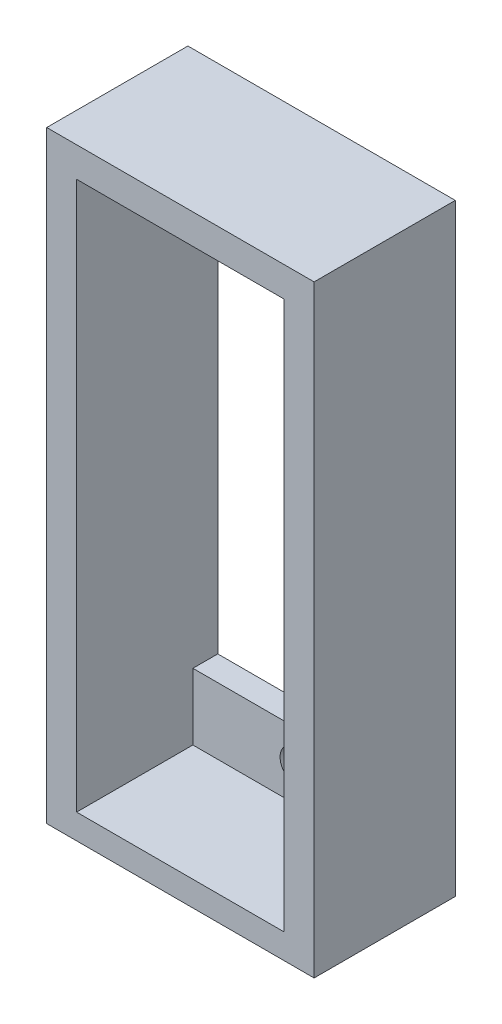
ISO-10303-21;
HEADER;
FILE_DESCRIPTION(('STEP AP214'),'2;1');
FILE_NAME('part.step','',(''),(''),'','','');
FILE_SCHEMA(('AUTOMOTIVE_DESIGN { 1 0 10303 214 1 1 1 1 }'));
ENDSEC;
DATA;
#1=APPLICATION_CONTEXT('core data for automotive mechanical design processes');
#2=APPLICATION_PROTOCOL_DEFINITION('international standard','automotive_design',2000,#1);
#3=PRODUCT_CONTEXT('',#1,'mechanical');
#4=PRODUCT('Part','Part','',(#3));
#5=PRODUCT_RELATED_PRODUCT_CATEGORY('part','',(#4));
#6=PRODUCT_DEFINITION_FORMATION('','',#4);
#7=PRODUCT_DEFINITION_CONTEXT('part definition',#1,'design');
#8=PRODUCT_DEFINITION('design','',#6,#7);
#9=PRODUCT_DEFINITION_SHAPE('','',#8);
#10=(LENGTH_UNIT() NAMED_UNIT(*) SI_UNIT(.MILLI.,.METRE.));
#11=(NAMED_UNIT(*) PLANE_ANGLE_UNIT() SI_UNIT($,.RADIAN.));
#12=(NAMED_UNIT(*) SI_UNIT($,.STERADIAN.) SOLID_ANGLE_UNIT());
#13=UNCERTAINTY_MEASURE_WITH_UNIT(LENGTH_MEASURE(1.E-05),#10,'distance_accuracy_value','');
#14=(GEOMETRIC_REPRESENTATION_CONTEXT(3) GLOBAL_UNCERTAINTY_ASSIGNED_CONTEXT((#13)) GLOBAL_UNIT_ASSIGNED_CONTEXT((#10,
#11,#12)) REPRESENTATION_CONTEXT('',''));
#15=CARTESIAN_POINT('',(0.,0.,0.));
#16=DIRECTION('',(0.,0.,1.));
#17=DIRECTION('',(1.,0.,0.));
#18=AXIS2_PLACEMENT_3D('',#15,#16,#17);
#19=CARTESIAN_POINT('',(-57.4856719225406,21.2865890189122,0.));
#20=DIRECTION('',(-1.,0.,0.));
#21=DIRECTION('',(0.,0.,1.));
#22=AXIS2_PLACEMENT_3D('',#19,#20,#21);
#23=PLANE('',#22);
#24=DIRECTION('',(0.,0.,1.));
#25=VECTOR('',#24,1.);
#26=CARTESIAN_POINT('',(-57.4856719225406,-7.71341098108776,8.9));
#27=LINE('',#26,#25);
#28=CARTESIAN_POINT('',(-57.4856719225406,-7.71341098108776,16.4));
#29=VERTEX_POINT('',#28);
#30=CARTESIAN_POINT('',(-57.4856719225406,-7.71341098108776,17.9));
#31=VERTEX_POINT('',#30);
#32=EDGE_CURVE('E268',#29,#31,#27,.T.);
#33=ORIENTED_EDGE('',*,*,#32,.F.);
#34=DIRECTION('',(0.,1.,0.));
#35=VECTOR('',#34,1.);
#36=CARTESIAN_POINT('',(-57.4856719225406,21.2865890189122,16.4));
#37=LINE('',#36,#35);
#38=CARTESIAN_POINT('',(-57.4856719225406,15.2865890189122,16.4));
#39=VERTEX_POINT('',#38);
#40=EDGE_CURVE('E294',#29,#39,#37,.T.);
#41=ORIENTED_EDGE('',*,*,#40,.T.);
#42=DIRECTION('',(0.,0.,1.));
#43=VECTOR('',#42,1.);
#44=CARTESIAN_POINT('',(-57.4856719225406,15.2865890189122,8.9));
#45=LINE('',#44,#43);
#46=CARTESIAN_POINT('',(-57.4856719225406,15.2865890189122,17.9));
#47=VERTEX_POINT('',#46);
#48=EDGE_CURVE('E270',#39,#47,#45,.T.);
#49=ORIENTED_EDGE('',*,*,#48,.T.);
#50=DIRECTION('',(0.,1.,0.));
#51=VECTOR('',#50,1.);
#52=CARTESIAN_POINT('',(-57.4856719225406,-11.7134109810878,17.9));
#53=LINE('',#52,#51);
#54=CARTESIAN_POINT('',(-57.4856719225406,21.2865890189122,17.9));
#55=VERTEX_POINT('',#54);
#56=EDGE_CURVE('E173',#47,#55,#53,.T.);
#57=ORIENTED_EDGE('',*,*,#56,.T.);
#58=DIRECTION('',(0.,0.,-1.));
#59=VECTOR('',#58,1.);
#60=CARTESIAN_POINT('',(-57.4856719225406,21.2865890189122,24.9));
#61=LINE('',#60,#59);
#62=CARTESIAN_POINT('',(-57.4856719225406,21.2865890189122,24.9));
#63=VERTEX_POINT('',#62);
#64=EDGE_CURVE('E200',#63,#55,#61,.T.);
#65=ORIENTED_EDGE('',*,*,#64,.F.);
#66=DIRECTION('',(0.,-1.,0.));
#67=VECTOR('',#66,1.);
#68=CARTESIAN_POINT('',(-57.4856719225406,21.2865890189122,24.9));
#69=LINE('',#68,#67);
#70=CARTESIAN_POINT('',(-57.4856719225406,-11.7134109810878,24.9));
#71=VERTEX_POINT('',#70);
#72=EDGE_CURVE('E189',#63,#71,#69,.T.);
#73=ORIENTED_EDGE('',*,*,#72,.T.);
#74=DIRECTION('',(0.,0.,-1.));
#75=VECTOR('',#74,1.);
#76=CARTESIAN_POINT('',(-57.4856719225406,-11.7134109810878,24.9));
#77=LINE('',#76,#75);
#78=CARTESIAN_POINT('',(-57.4856719225406,-11.7134109810878,17.9));
#79=VERTEX_POINT('',#78);
#80=EDGE_CURVE('E197',#71,#79,#77,.T.);
#81=ORIENTED_EDGE('',*,*,#80,.T.);
#82=EDGE_CURVE('E178',#79,#31,#53,.T.);
#83=ORIENTED_EDGE('',*,*,#82,.T.);
#84=EDGE_LOOP('',(#33,#41,#49,#57,#65,#73,#81,#83));
#85=FACE_BOUND('',#84,.T.);
#86=ADVANCED_FACE('F33',(#85),#23,.F.);
#87=CARTESIAN_POINT('',(-44.9856719225406,10.5865890189122,0.));
#88=DIRECTION('',(1.,0.,0.));
#89=DIRECTION('',(0.,0.,-1.));
#90=AXIS2_PLACEMENT_3D('',#87,#88,#89);
#91=PLANE('',#90);
#92=DIRECTION('',(0.,0.,1.));
#93=VECTOR('',#92,1.);
#94=CARTESIAN_POINT('',(-44.9856719225406,15.2865890189122,8.9));
#95=LINE('',#94,#93);
#96=CARTESIAN_POINT('',(-44.9856719225406,15.2865890189122,16.4));
#97=VERTEX_POINT('',#96);
#98=CARTESIAN_POINT('',(-44.9856719225406,15.2865890189122,17.9));
#99=VERTEX_POINT('',#98);
#100=EDGE_CURVE('E162',#97,#99,#95,.T.);
#101=ORIENTED_EDGE('',*,*,#100,.F.);
#102=DIRECTION('',(0.,-1.,0.));
#103=VECTOR('',#102,1.);
#104=CARTESIAN_POINT('',(-44.9856719225406,10.5865890189122,16.4));
#105=LINE('',#104,#103);
#106=CARTESIAN_POINT('',(-44.9856719225406,-7.71341098108776,16.4));
#107=VERTEX_POINT('',#106);
#108=EDGE_CURVE('E55',#97,#107,#105,.T.);
#109=ORIENTED_EDGE('',*,*,#108,.T.);
#110=DIRECTION('',(0.,0.,1.));
#111=VECTOR('',#110,1.);
#112=CARTESIAN_POINT('',(-44.9856719225406,-7.71341098108776,8.9));
#113=LINE('',#112,#111);
#114=CARTESIAN_POINT('',(-44.9856719225406,-7.71341098108776,17.9));
#115=VERTEX_POINT('',#114);
#116=EDGE_CURVE('E177',#107,#115,#113,.T.);
#117=ORIENTED_EDGE('',*,*,#116,.T.);
#118=DIRECTION('',(0.,1.,0.));
#119=VECTOR('',#118,1.);
#120=CARTESIAN_POINT('',(-44.9856719225406,-11.7134109810878,17.9));
#121=LINE('',#120,#119);
#122=CARTESIAN_POINT('',(-44.9856719225406,-11.7134109810878,17.9));
#123=VERTEX_POINT('',#122);
#124=EDGE_CURVE('E182',#123,#115,#121,.T.);
#125=ORIENTED_EDGE('',*,*,#124,.F.);
#126=DIRECTION('',(0.,0.,-1.));
#127=VECTOR('',#126,1.);
#128=CARTESIAN_POINT('',(-44.9856719225406,-11.7134109810878,24.9));
#129=LINE('',#128,#127);
#130=CARTESIAN_POINT('',(-44.9856719225406,-11.7134109810878,24.9));
#131=VERTEX_POINT('',#130);
#132=EDGE_CURVE('E194',#131,#123,#129,.T.);
#133=ORIENTED_EDGE('',*,*,#132,.F.);
#134=DIRECTION('',(0.,1.,0.));
#135=VECTOR('',#134,1.);
#136=CARTESIAN_POINT('',(-44.9856719225406,21.2865890189122,24.9));
#137=LINE('',#136,#135);
#138=CARTESIAN_POINT('',(-44.9856719225406,21.2865890189122,24.9));
#139=VERTEX_POINT('',#138);
#140=EDGE_CURVE('E185',#131,#139,#137,.T.);
#141=ORIENTED_EDGE('',*,*,#140,.T.);
#142=DIRECTION('',(0.,0.,-1.));
#143=VECTOR('',#142,1.);
#144=CARTESIAN_POINT('',(-44.9856719225406,21.2865890189122,24.9));
#145=LINE('',#144,#143);
#146=CARTESIAN_POINT('',(-44.9856719225406,21.2865890189122,17.9));
#147=VERTEX_POINT('',#146);
#148=EDGE_CURVE('E203',#139,#147,#145,.T.);
#149=ORIENTED_EDGE('',*,*,#148,.T.);
#150=EDGE_CURVE('E181',#99,#147,#121,.T.);
#151=ORIENTED_EDGE('',*,*,#150,.F.);
#152=EDGE_LOOP('',(#101,#109,#117,#125,#133,#141,#149,#151));
#153=FACE_BOUND('',#152,.T.);
#154=ADVANCED_FACE('F335',(#153),#91,.F.);
#155=CARTESIAN_POINT('',(-57.4856719225406,-11.7134109810878,17.9));
#156=DIRECTION('',(0.,0.,-1.));
#157=DIRECTION('',(-1.,0.,0.));
#158=AXIS2_PLACEMENT_3D('',#155,#156,#157);
#159=PLANE('',#158);
#160=CARTESIAN_POINT('',(-51.2356719225406,18.3365890189122,17.9));
#161=DIRECTION('',(0.,0.,1.));
#162=DIRECTION('',(1.,0.,0.));
#163=AXIS2_PLACEMENT_3D('',#160,#161,#162);
#164=CIRCLE('',#163,0.999999999999998);
#165=CARTESIAN_POINT('',(-50.2356719225406,18.3365890189122,17.9));
#166=VERTEX_POINT('',#165);
#167=EDGE_CURVE('E247',#166,#166,#164,.T.);
#168=ORIENTED_EDGE('',*,*,#167,.F.);
#169=EDGE_LOOP('',(#168));
#170=FACE_BOUND('',#169,.T.);
#171=DIRECTION('',(-1.,0.,0.));
#172=VECTOR('',#171,1.);
#173=CARTESIAN_POINT('',(-44.9856719225406,15.2865890189122,17.9));
#174=LINE('',#173,#172);
#175=CARTESIAN_POINT('',(-49.2356719225406,15.2865890189122,17.9));
#176=VERTEX_POINT('',#175);
#177=EDGE_CURVE('E160',#99,#176,#174,.T.);
#178=ORIENTED_EDGE('',*,*,#177,.F.);
#179=ORIENTED_EDGE('',*,*,#150,.T.);
#180=DIRECTION('',(-1.,0.,0.));
#181=VECTOR('',#180,1.);
#182=CARTESIAN_POINT('',(-57.4856719225406,21.2865890189122,17.9));
#183=LINE('',#182,#181);
#184=EDGE_CURVE('E174',#147,#55,#183,.T.);
#185=ORIENTED_EDGE('',*,*,#184,.T.);
#186=ORIENTED_EDGE('',*,*,#56,.F.);
#187=DIRECTION('',(-1.,0.,0.));
#188=VECTOR('',#187,1.);
#189=CARTESIAN_POINT('',(-53.2356719225406,15.2865890189122,17.9));
#190=LINE('',#189,#188);
#191=CARTESIAN_POINT('',(-53.2356719225406,15.2865890189122,17.9));
#192=VERTEX_POINT('',#191);
#193=EDGE_CURVE('E262',#192,#47,#190,.T.);
#194=ORIENTED_EDGE('',*,*,#193,.F.);
#195=DIRECTION('',(0.,-1.,0.));
#196=VECTOR('',#195,1.);
#197=CARTESIAN_POINT('',(-53.2356719225406,17.2865890189122,17.9));
#198=LINE('',#197,#196);
#199=CARTESIAN_POINT('',(-53.2356719225406,17.2865890189122,17.9));
#200=VERTEX_POINT('',#199);
#201=EDGE_CURVE('E259',#200,#192,#198,.T.);
#202=ORIENTED_EDGE('',*,*,#201,.F.);
#203=DIRECTION('',(-1.,0.,0.));
#204=VECTOR('',#203,1.);
#205=CARTESIAN_POINT('',(-49.2356719225406,17.2865890189122,17.9));
#206=LINE('',#205,#204);
#207=CARTESIAN_POINT('',(-49.2356719225406,17.2865890189122,17.9));
#208=VERTEX_POINT('',#207);
#209=EDGE_CURVE('E256',#208,#200,#206,.T.);
#210=ORIENTED_EDGE('',*,*,#209,.F.);
#211=DIRECTION('',(0.,1.,0.));
#212=VECTOR('',#211,1.);
#213=CARTESIAN_POINT('',(-49.2356719225406,15.2865890189122,17.9));
#214=LINE('',#213,#212);
#215=EDGE_CURVE('E254',#176,#208,#214,.T.);
#216=ORIENTED_EDGE('',*,*,#215,.F.);
#217=EDGE_LOOP('',(#178,#179,#185,#186,#194,#202,#210,#216));
#218=FACE_BOUND('',#217,.T.);
#219=ADVANCED_FACE('F285',(#170,#218),#159,.F.);
#220=CARTESIAN_POINT('',(-51.2356719225406,-9.71341098108776,17.9));
#221=DIRECTION('',(0.,0.,1.));
#222=DIRECTION('',(1.,0.,0.));
#223=AXIS2_PLACEMENT_3D('',#220,#221,#222);
#224=CIRCLE('',#223,0.999999999999998);
#225=CARTESIAN_POINT('',(-50.2356719225406,-9.71341098108776,17.9));
#226=VERTEX_POINT('',#225);
#227=EDGE_CURVE('E248',#226,#226,#224,.T.);
#228=ORIENTED_EDGE('',*,*,#227,.F.);
#229=EDGE_LOOP('',(#228));
#230=FACE_BOUND('',#229,.T.);
#231=DIRECTION('',(1.,0.,0.));
#232=VECTOR('',#231,1.);
#233=CARTESIAN_POINT('',(-44.9856719225406,-7.71341098108776,17.9));
#234=LINE('',#233,#232);
#235=EDGE_CURVE('E166',#31,#115,#234,.T.);
#236=ORIENTED_EDGE('',*,*,#235,.F.);
#237=ORIENTED_EDGE('',*,*,#82,.F.);
#238=DIRECTION('',(-1.,0.,0.));
#239=VECTOR('',#238,1.);
#240=CARTESIAN_POINT('',(-57.4856719225406,-11.7134109810878,17.9));
#241=LINE('',#240,#239);
#242=EDGE_CURVE('E170',#123,#79,#241,.T.);
#243=ORIENTED_EDGE('',*,*,#242,.F.);
#244=ORIENTED_EDGE('',*,*,#124,.T.);
#245=EDGE_LOOP('',(#236,#237,#243,#244));
#246=FACE_BOUND('',#245,.T.);
#247=ADVANCED_FACE('F342',(#230,#246),#159,.F.);
#248=CARTESIAN_POINT('',(-57.4856719225406,-11.7134109810878,24.9));
#249=DIRECTION('',(0.,1.,0.));
#250=DIRECTION('',(0.,0.,1.));
#251=AXIS2_PLACEMENT_3D('',#248,#249,#250);
#252=PLANE('',#251);
#253=ORIENTED_EDGE('',*,*,#132,.T.);
#254=ORIENTED_EDGE('',*,*,#242,.T.);
#255=ORIENTED_EDGE('',*,*,#80,.F.);
#256=DIRECTION('',(1.,0.,0.));
#257=VECTOR('',#256,1.);
#258=CARTESIAN_POINT('',(-57.4856719225406,-11.7134109810878,24.9));
#259=LINE('',#258,#257);
#260=EDGE_CURVE('E192',#71,#131,#259,.T.);
#261=ORIENTED_EDGE('',*,*,#260,.T.);
#262=EDGE_LOOP('',(#253,#254,#255,#261));
#263=FACE_BOUND('',#262,.T.);
#264=ADVANCED_FACE('F339',(#263),#252,.T.);
#265=CARTESIAN_POINT('',(-57.4856719225406,21.2865890189122,24.9));
#266=DIRECTION('',(0.,-1.,0.));
#267=DIRECTION('',(1.,0.,0.));
#268=AXIS2_PLACEMENT_3D('',#265,#266,#267);
#269=PLANE('',#268);
#270=ORIENTED_EDGE('',*,*,#64,.T.);
#271=ORIENTED_EDGE('',*,*,#184,.F.);
#272=ORIENTED_EDGE('',*,*,#148,.F.);
#273=DIRECTION('',(-1.,0.,0.));
#274=VECTOR('',#273,1.);
#275=CARTESIAN_POINT('',(-57.4856719225406,21.2865890189122,24.9));
#276=LINE('',#275,#274);
#277=EDGE_CURVE('E187',#139,#63,#276,.T.);
#278=ORIENTED_EDGE('',*,*,#277,.T.);
#279=EDGE_LOOP('',(#270,#271,#272,#278));
#280=FACE_BOUND('',#279,.T.);
#281=ADVANCED_FACE('F321',(#280),#269,.T.);
#282=CARTESIAN_POINT('',(0.,0.,24.9));
#283=DIRECTION('',(0.,0.,1.));
#284=DIRECTION('',(1.,0.,0.));
#285=AXIS2_PLACEMENT_3D('',#282,#283,#284);
#286=PLANE('',#285);
#287=DIRECTION('',(0.,-1.,0.));
#288=VECTOR('',#287,1.);
#289=CARTESIAN_POINT('',(-59.2856719225406,23.0865890189122,24.9));
#290=LINE('',#289,#288);
#291=CARTESIAN_POINT('',(-59.2856719225406,23.0865890189122,24.9));
#292=VERTEX_POINT('',#291);
#293=CARTESIAN_POINT('',(-59.2856719225406,-13.2134109810878,24.9));
#294=VERTEX_POINT('',#293);
#295=EDGE_CURVE('E206',#292,#294,#290,.T.);
#296=ORIENTED_EDGE('',*,*,#295,.T.);
#297=DIRECTION('',(1.,0.,0.));
#298=VECTOR('',#297,1.);
#299=CARTESIAN_POINT('',(-59.2856719225406,-13.2134109810878,24.9));
#300=LINE('',#299,#298);
#301=CARTESIAN_POINT('',(-43.1856719225406,-13.2134109810878,24.9));
#302=VERTEX_POINT('',#301);
#303=EDGE_CURVE('E209',#294,#302,#300,.T.);
#304=ORIENTED_EDGE('',*,*,#303,.T.);
#305=DIRECTION('',(0.,1.,0.));
#306=VECTOR('',#305,1.);
#307=CARTESIAN_POINT('',(-43.1856719225406,23.0865890189122,24.9));
#308=LINE('',#307,#306);
#309=CARTESIAN_POINT('',(-43.1856719225406,23.0865890189122,24.9));
#310=VERTEX_POINT('',#309);
#311=EDGE_CURVE('E211',#302,#310,#308,.T.);
#312=ORIENTED_EDGE('',*,*,#311,.T.);
#313=DIRECTION('',(-1.,0.,0.));
#314=VECTOR('',#313,1.);
#315=CARTESIAN_POINT('',(-59.2856719225406,23.0865890189122,24.9));
#316=LINE('',#315,#314);
#317=EDGE_CURVE('E213',#310,#292,#316,.T.);
#318=ORIENTED_EDGE('',*,*,#317,.T.);
#319=EDGE_LOOP('',(#296,#304,#312,#318));
#320=FACE_BOUND('',#319,.T.);
#321=ORIENTED_EDGE('',*,*,#277,.F.);
#322=ORIENTED_EDGE('',*,*,#140,.F.);
#323=ORIENTED_EDGE('',*,*,#260,.F.);
#324=ORIENTED_EDGE('',*,*,#72,.F.);
#325=EDGE_LOOP('',(#321,#322,#323,#324));
#326=FACE_BOUND('',#325,.T.);
#327=ADVANCED_FACE('F318',(#320,#326),#286,.T.);
#328=CARTESIAN_POINT('',(-59.2856719225406,23.0865890189122,24.9));
#329=DIRECTION('',(0.,-1.,0.));
#330=DIRECTION('',(0.,0.,-1.));
#331=AXIS2_PLACEMENT_3D('',#328,#329,#330);
#332=PLANE('',#331);
#333=DIRECTION('',(0.,0.,-1.));
#334=VECTOR('',#333,1.);
#335=CARTESIAN_POINT('',(-43.1856719225406,23.0865890189122,24.9));
#336=LINE('',#335,#334);
#337=CARTESIAN_POINT('',(-43.1856719225406,23.0865890189122,16.4));
#338=VERTEX_POINT('',#337);
#339=EDGE_CURVE('E218',#310,#338,#336,.T.);
#340=ORIENTED_EDGE('',*,*,#339,.T.);
#341=DIRECTION('',(-1.,0.,0.));
#342=VECTOR('',#341,1.);
#343=CARTESIAN_POINT('',(-59.2856719225406,23.0865890189122,16.4));
#344=LINE('',#343,#342);
#345=CARTESIAN_POINT('',(-59.2856719225406,23.0865890189122,16.4));
#346=VERTEX_POINT('',#345);
#347=EDGE_CURVE('E245',#338,#346,#344,.T.);
#348=ORIENTED_EDGE('',*,*,#347,.T.);
#349=DIRECTION('',(0.,0.,-1.));
#350=VECTOR('',#349,1.);
#351=CARTESIAN_POINT('',(-59.2856719225406,23.0865890189122,24.9));
#352=LINE('',#351,#350);
#353=EDGE_CURVE('E215',#292,#346,#352,.T.);
#354=ORIENTED_EDGE('',*,*,#353,.F.);
#355=ORIENTED_EDGE('',*,*,#317,.F.);
#356=EDGE_LOOP('',(#340,#348,#354,#355));
#357=FACE_BOUND('',#356,.T.);
#358=ADVANCED_FACE('F316',(#357),#332,.F.);
#359=CARTESIAN_POINT('',(-43.1856719225406,23.0865890189122,24.9));
#360=DIRECTION('',(-1.,0.,0.));
#361=DIRECTION('',(0.,-1.,0.));
#362=AXIS2_PLACEMENT_3D('',#359,#360,#361);
#363=PLANE('',#362);
#364=DIRECTION('',(0.,0.,-1.));
#365=VECTOR('',#364,1.);
#366=CARTESIAN_POINT('',(-43.1856719225406,-13.2134109810878,24.9));
#367=LINE('',#366,#365);
#368=CARTESIAN_POINT('',(-43.1856719225406,-13.2134109810878,16.4));
#369=VERTEX_POINT('',#368);
#370=EDGE_CURVE('E221',#302,#369,#367,.T.);
#371=ORIENTED_EDGE('',*,*,#370,.T.);
#372=DIRECTION('',(0.,1.,0.));
#373=VECTOR('',#372,1.);
#374=CARTESIAN_POINT('',(-43.1856719225406,23.0865890189122,16.4));
#375=LINE('',#374,#373);
#376=EDGE_CURVE('E236',#369,#338,#375,.T.);
#377=ORIENTED_EDGE('',*,*,#376,.T.);
#378=ORIENTED_EDGE('',*,*,#339,.F.);
#379=ORIENTED_EDGE('',*,*,#311,.F.);
#380=EDGE_LOOP('',(#371,#377,#378,#379));
#381=FACE_BOUND('',#380,.T.);
#382=ADVANCED_FACE('F312',(#381),#363,.F.);
#383=CARTESIAN_POINT('',(-59.2856719225406,-13.2134109810878,24.9));
#384=DIRECTION('',(0.,1.,0.));
#385=DIRECTION('',(0.,0.,1.));
#386=AXIS2_PLACEMENT_3D('',#383,#384,#385);
#387=PLANE('',#386);
#388=DIRECTION('',(0.,0.,-1.));
#389=VECTOR('',#388,1.);
#390=CARTESIAN_POINT('',(-59.2856719225406,-13.2134109810878,24.9));
#391=LINE('',#390,#389);
#392=CARTESIAN_POINT('',(-59.2856719225406,-13.2134109810878,16.4));
#393=VERTEX_POINT('',#392);
#394=EDGE_CURVE('E40',#294,#393,#391,.T.);
#395=ORIENTED_EDGE('',*,*,#394,.T.);
#396=DIRECTION('',(1.,0.,0.));
#397=VECTOR('',#396,1.);
#398=CARTESIAN_POINT('',(-59.2856719225406,-13.2134109810878,16.4));
#399=LINE('',#398,#397);
#400=EDGE_CURVE('E47',#393,#369,#399,.T.);
#401=ORIENTED_EDGE('',*,*,#400,.T.);
#402=ORIENTED_EDGE('',*,*,#370,.F.);
#403=ORIENTED_EDGE('',*,*,#303,.F.);
#404=EDGE_LOOP('',(#395,#401,#402,#403));
#405=FACE_BOUND('',#404,.T.);
#406=ADVANCED_FACE('F226',(#405),#387,.F.);
#407=CARTESIAN_POINT('',(-59.2856719225406,23.0865890189122,24.9));
#408=DIRECTION('',(1.,0.,0.));
#409=DIRECTION('',(0.,0.,-1.));
#410=AXIS2_PLACEMENT_3D('',#407,#408,#409);
#411=PLANE('',#410);
#412=ORIENTED_EDGE('',*,*,#353,.T.);
#413=DIRECTION('',(0.,-1.,0.));
#414=VECTOR('',#413,1.);
#415=CARTESIAN_POINT('',(-59.2856719225406,23.0865890189122,16.4));
#416=LINE('',#415,#414);
#417=EDGE_CURVE('E231',#346,#393,#416,.T.);
#418=ORIENTED_EDGE('',*,*,#417,.T.);
#419=ORIENTED_EDGE('',*,*,#394,.F.);
#420=ORIENTED_EDGE('',*,*,#295,.F.);
#421=EDGE_LOOP('',(#412,#418,#419,#420));
#422=FACE_BOUND('',#421,.T.);
#423=ADVANCED_FACE('F230',(#422),#411,.F.);
#424=CARTESIAN_POINT('',(-51.2356719225406,-9.71341098108776,8.9));
#425=DIRECTION('',(0.,0.,1.));
#426=DIRECTION('',(1.,0.,0.));
#427=AXIS2_PLACEMENT_3D('',#424,#425,#426);
#428=CYLINDRICAL_SURFACE('',#427,0.999999999999998);
#429=CARTESIAN_POINT('',(-51.2356719225406,-9.71341098108776,16.4));
#430=DIRECTION('',(0.,0.,1.));
#431=DIRECTION('',(1.,0.,0.));
#432=AXIS2_PLACEMENT_3D('',#429,#430,#431);
#433=CIRCLE('',#432,0.999999999999998);
#434=CARTESIAN_POINT('',(-50.2356719225406,-9.71341098108776,16.4));
#435=VERTEX_POINT('',#434);
#436=EDGE_CURVE('E234',#435,#435,#433,.F.);
#437=ORIENTED_EDGE('',*,*,#436,.T.);
#438=EDGE_LOOP('',(#437));
#439=FACE_BOUND('',#438,.T.);
#440=ORIENTED_EDGE('',*,*,#227,.T.);
#441=EDGE_LOOP('',(#440));
#442=FACE_BOUND('',#441,.T.);
#443=ADVANCED_FACE('F353',(#439,#442),#428,.F.);
#444=CARTESIAN_POINT('',(-51.2356719225406,18.3365890189122,8.9));
#445=DIRECTION('',(0.,0.,1.));
#446=DIRECTION('',(1.,0.,0.));
#447=AXIS2_PLACEMENT_3D('',#444,#445,#446);
#448=CYLINDRICAL_SURFACE('',#447,0.999999999999998);
#449=CARTESIAN_POINT('',(-51.2356719225406,18.3365890189122,16.4));
#450=DIRECTION('',(0.,0.,1.));
#451=DIRECTION('',(1.,0.,0.));
#452=AXIS2_PLACEMENT_3D('',#449,#450,#451);
#453=CIRCLE('',#452,0.999999999999998);
#454=CARTESIAN_POINT('',(-50.2356719225406,18.3365890189122,16.4));
#455=VERTEX_POINT('',#454);
#456=EDGE_CURVE('E239',#455,#455,#453,.F.);
#457=ORIENTED_EDGE('',*,*,#456,.T.);
#458=EDGE_LOOP('',(#457));
#459=FACE_BOUND('',#458,.T.);
#460=ORIENTED_EDGE('',*,*,#167,.T.);
#461=EDGE_LOOP('',(#460));
#462=FACE_BOUND('',#461,.T.);
#463=ADVANCED_FACE('F305',(#459,#462),#448,.F.);
#464=CARTESIAN_POINT('',(-44.9856719225406,-7.71341098108776,8.9));
#465=DIRECTION('',(0.,-1.,0.));
#466=DIRECTION('',(1.,0.,0.));
#467=AXIS2_PLACEMENT_3D('',#464,#465,#466);
#468=PLANE('',#467);
#469=ORIENTED_EDGE('',*,*,#116,.F.);
#470=DIRECTION('',(-1.,0.,0.));
#471=VECTOR('',#470,1.);
#472=CARTESIAN_POINT('',(-44.9856719225406,-7.71341098108776,16.4));
#473=LINE('',#472,#471);
#474=EDGE_CURVE('E300',#107,#29,#473,.T.);
#475=ORIENTED_EDGE('',*,*,#474,.T.);
#476=ORIENTED_EDGE('',*,*,#32,.T.);
#477=ORIENTED_EDGE('',*,*,#235,.T.);
#478=EDGE_LOOP('',(#469,#475,#476,#477));
#479=FACE_BOUND('',#478,.T.);
#480=ADVANCED_FACE('F345',(#479),#468,.F.);
#481=CARTESIAN_POINT('',(-53.2356719225406,15.2865890189122,8.9));
#482=DIRECTION('',(0.,1.,0.));
#483=DIRECTION('',(-1.,0.,0.));
#484=AXIS2_PLACEMENT_3D('',#481,#482,#483);
#485=PLANE('',#484);
#486=ORIENTED_EDGE('',*,*,#48,.F.);
#487=DIRECTION('',(1.,0.,0.));
#488=VECTOR('',#487,1.);
#489=CARTESIAN_POINT('',(-53.2356719225406,15.2865890189122,16.4));
#490=LINE('',#489,#488);
#491=CARTESIAN_POINT('',(-53.2356719225406,15.2865890189122,16.4));
#492=VERTEX_POINT('',#491);
#493=EDGE_CURVE('E291',#39,#492,#490,.T.);
#494=ORIENTED_EDGE('',*,*,#493,.T.);
#495=DIRECTION('',(0.,0.,1.));
#496=VECTOR('',#495,1.);
#497=CARTESIAN_POINT('',(-53.2356719225406,15.2865890189122,8.9));
#498=LINE('',#497,#496);
#499=EDGE_CURVE('E272',#492,#192,#498,.T.);
#500=ORIENTED_EDGE('',*,*,#499,.T.);
#501=ORIENTED_EDGE('',*,*,#193,.T.);
#502=EDGE_LOOP('',(#486,#494,#500,#501));
#503=FACE_BOUND('',#502,.T.);
#504=ADVANCED_FACE('F289',(#503),#485,.F.);
#505=CARTESIAN_POINT('',(-53.2356719225406,17.2865890189122,8.9));
#506=DIRECTION('',(-1.,0.,0.));
#507=DIRECTION('',(0.,0.,1.));
#508=AXIS2_PLACEMENT_3D('',#505,#506,#507);
#509=PLANE('',#508);
#510=ORIENTED_EDGE('',*,*,#499,.F.);
#511=DIRECTION('',(0.,1.,0.));
#512=VECTOR('',#511,1.);
#513=CARTESIAN_POINT('',(-53.2356719225406,17.2865890189122,16.4));
#514=LINE('',#513,#512);
#515=CARTESIAN_POINT('',(-53.2356719225406,17.2865890189122,16.4));
#516=VERTEX_POINT('',#515);
#517=EDGE_CURVE('E280',#492,#516,#514,.T.);
#518=ORIENTED_EDGE('',*,*,#517,.T.);
#519=DIRECTION('',(0.,0.,1.));
#520=VECTOR('',#519,1.);
#521=CARTESIAN_POINT('',(-53.2356719225406,17.2865890189122,8.9));
#522=LINE('',#521,#520);
#523=EDGE_CURVE('E164',#516,#200,#522,.T.);
#524=ORIENTED_EDGE('',*,*,#523,.T.);
#525=ORIENTED_EDGE('',*,*,#201,.T.);
#526=EDGE_LOOP('',(#510,#518,#524,#525));
#527=FACE_BOUND('',#526,.T.);
#528=ADVANCED_FACE('F277',(#527),#509,.F.);
#529=CARTESIAN_POINT('',(-49.2356719225406,17.2865890189122,8.9));
#530=DIRECTION('',(0.,1.,0.));
#531=DIRECTION('',(0.,0.,1.));
#532=AXIS2_PLACEMENT_3D('',#529,#530,#531);
#533=PLANE('',#532);
#534=ORIENTED_EDGE('',*,*,#523,.F.);
#535=DIRECTION('',(1.,0.,0.));
#536=VECTOR('',#535,1.);
#537=CARTESIAN_POINT('',(-49.2356719225406,17.2865890189122,16.4));
#538=LINE('',#537,#536);
#539=CARTESIAN_POINT('',(-49.2356719225406,17.2865890189122,16.4));
#540=VERTEX_POINT('',#539);
#541=EDGE_CURVE('E156',#516,#540,#538,.T.);
#542=ORIENTED_EDGE('',*,*,#541,.T.);
#543=DIRECTION('',(0.,0.,1.));
#544=VECTOR('',#543,1.);
#545=CARTESIAN_POINT('',(-49.2356719225406,17.2865890189122,8.9));
#546=LINE('',#545,#544);
#547=EDGE_CURVE('E155',#540,#208,#546,.T.);
#548=ORIENTED_EDGE('',*,*,#547,.T.);
#549=ORIENTED_EDGE('',*,*,#209,.T.);
#550=EDGE_LOOP('',(#534,#542,#548,#549));
#551=FACE_BOUND('',#550,.T.);
#552=ADVANCED_FACE('F283',(#551),#533,.F.);
#553=CARTESIAN_POINT('',(-49.2356719225406,15.2865890189122,8.9));
#554=DIRECTION('',(1.,0.,0.));
#555=DIRECTION('',(0.,0.,-1.));
#556=AXIS2_PLACEMENT_3D('',#553,#554,#555);
#557=PLANE('',#556);
#558=ORIENTED_EDGE('',*,*,#547,.F.);
#559=DIRECTION('',(0.,-1.,0.));
#560=VECTOR('',#559,1.);
#561=CARTESIAN_POINT('',(-49.2356719225406,15.2865890189122,16.4));
#562=LINE('',#561,#560);
#563=CARTESIAN_POINT('',(-49.2356719225406,15.2865890189122,16.4));
#564=VERTEX_POINT('',#563);
#565=EDGE_CURVE('E144',#540,#564,#562,.T.);
#566=ORIENTED_EDGE('',*,*,#565,.T.);
#567=DIRECTION('',(0.,0.,1.));
#568=VECTOR('',#567,1.);
#569=CARTESIAN_POINT('',(-49.2356719225406,15.2865890189122,8.9));
#570=LINE('',#569,#568);
#571=EDGE_CURVE('E153',#564,#176,#570,.T.);
#572=ORIENTED_EDGE('',*,*,#571,.T.);
#573=ORIENTED_EDGE('',*,*,#215,.T.);
#574=EDGE_LOOP('',(#558,#566,#572,#573));
#575=FACE_BOUND('',#574,.T.);
#576=ADVANCED_FACE('F151',(#575),#557,.F.);
#577=CARTESIAN_POINT('',(-44.9856719225406,15.2865890189122,8.9));
#578=DIRECTION('',(0.,1.,0.));
#579=DIRECTION('',(0.,0.,1.));
#580=AXIS2_PLACEMENT_3D('',#577,#578,#579);
#581=PLANE('',#580);
#582=ORIENTED_EDGE('',*,*,#571,.F.);
#583=DIRECTION('',(1.,0.,0.));
#584=VECTOR('',#583,1.);
#585=CARTESIAN_POINT('',(-44.9856719225406,15.2865890189122,16.4));
#586=LINE('',#585,#584);
#587=EDGE_CURVE('E11',#564,#97,#586,.T.);
#588=ORIENTED_EDGE('',*,*,#587,.T.);
#589=ORIENTED_EDGE('',*,*,#100,.T.);
#590=ORIENTED_EDGE('',*,*,#177,.T.);
#591=EDGE_LOOP('',(#582,#588,#589,#590));
#592=FACE_BOUND('',#591,.T.);
#593=ADVANCED_FACE('F158',(#592),#581,.F.);
#594=CARTESIAN_POINT('',(-51.7497754564251,10.1317910065859,16.4));
#595=DIRECTION('',(0.,0.,1.));
#596=DIRECTION('',(1.,0.,0.));
#597=AXIS2_PLACEMENT_3D('',#594,#595,#596);
#598=PLANE('',#597);
#599=ORIENTED_EDGE('',*,*,#436,.F.);
#600=EDGE_LOOP('',(#599));
#601=FACE_BOUND('',#600,.T.);
#602=ORIENTED_EDGE('',*,*,#108,.F.);
#603=ORIENTED_EDGE('',*,*,#587,.F.);
#604=ORIENTED_EDGE('',*,*,#565,.F.);
#605=ORIENTED_EDGE('',*,*,#541,.F.);
#606=ORIENTED_EDGE('',*,*,#517,.F.);
#607=ORIENTED_EDGE('',*,*,#493,.F.);
#608=ORIENTED_EDGE('',*,*,#40,.F.);
#609=ORIENTED_EDGE('',*,*,#474,.F.);
#610=EDGE_LOOP('',(#602,#603,#604,#605,#606,#607,#608,#609));
#611=FACE_BOUND('',#610,.T.);
#612=ORIENTED_EDGE('',*,*,#456,.F.);
#613=EDGE_LOOP('',(#612));
#614=FACE_BOUND('',#613,.T.);
#615=ORIENTED_EDGE('',*,*,#376,.F.);
#616=ORIENTED_EDGE('',*,*,#400,.F.);
#617=ORIENTED_EDGE('',*,*,#417,.F.);
#618=ORIENTED_EDGE('',*,*,#347,.F.);
#619=EDGE_LOOP('',(#615,#616,#617,#618));
#620=FACE_BOUND('',#619,.T.);
#621=ADVANCED_FACE('F142',(#601,#611,#614,#620),#598,.F.);
#622=CLOSED_SHELL('',(#86,#154,#219,#247,#264,#281,#327,#358,#382,#406,#423,#443,#463,#480,#504,
#528,#552,#576,#593,#621));
#623=MANIFOLD_SOLID_BREP('B2',#622);
#624=ADVANCED_BREP_SHAPE_REPRESENTATION('',(#18,#623),#14);
#625=SHAPE_DEFINITION_REPRESENTATION(#9,#624);
ENDSEC;
END-ISO-10303-21;
